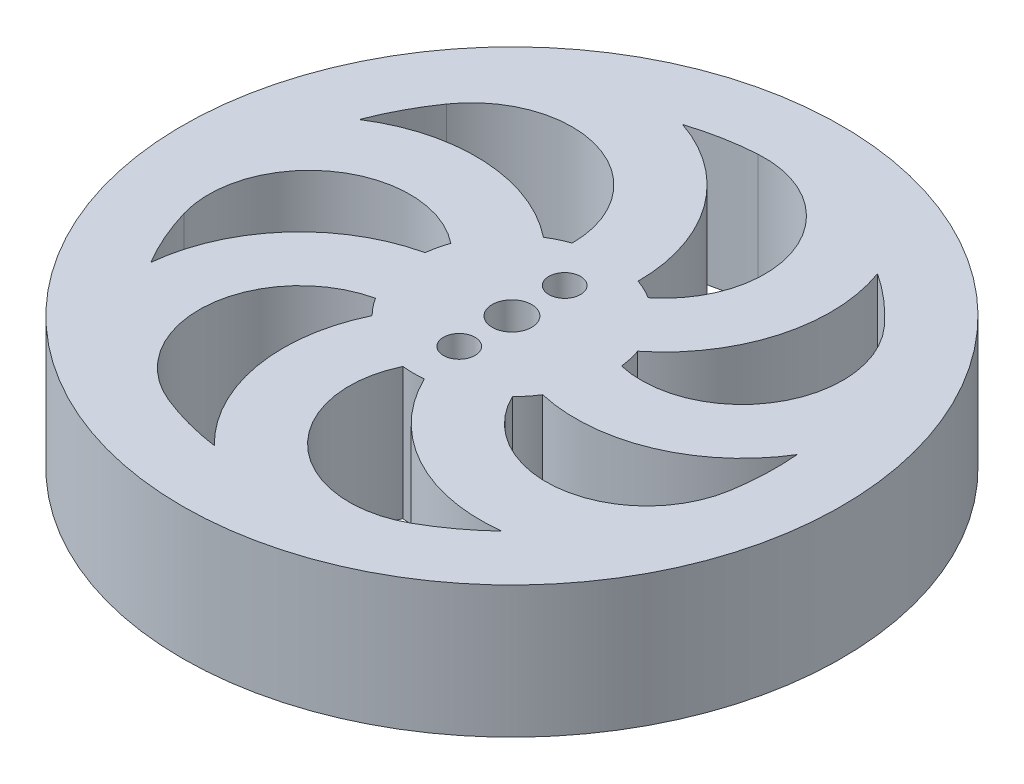
ISO-10303-21;
HEADER;
FILE_DESCRIPTION(('STEP AP214'),'2;1');
FILE_NAME('part.step','',(''),(''),'','','');
FILE_SCHEMA(('AUTOMOTIVE_DESIGN { 1 0 10303 214 1 1 1 1 }'));
ENDSEC;
DATA;
#1=APPLICATION_CONTEXT('core data for automotive mechanical design processes');
#2=APPLICATION_PROTOCOL_DEFINITION('international standard','automotive_design',2000,#1);
#3=PRODUCT_CONTEXT('',#1,'mechanical');
#4=PRODUCT('Part','Part','',(#3));
#5=PRODUCT_RELATED_PRODUCT_CATEGORY('part','',(#4));
#6=PRODUCT_DEFINITION_FORMATION('','',#4);
#7=PRODUCT_DEFINITION_CONTEXT('part definition',#1,'design');
#8=PRODUCT_DEFINITION('design','',#6,#7);
#9=PRODUCT_DEFINITION_SHAPE('','',#8);
#10=(LENGTH_UNIT() NAMED_UNIT(*) SI_UNIT(.MILLI.,.METRE.));
#11=(NAMED_UNIT(*) PLANE_ANGLE_UNIT() SI_UNIT($,.RADIAN.));
#12=(NAMED_UNIT(*) SI_UNIT($,.STERADIAN.) SOLID_ANGLE_UNIT());
#13=UNCERTAINTY_MEASURE_WITH_UNIT(LENGTH_MEASURE(1.E-05),#10,'distance_accuracy_value','');
#14=(GEOMETRIC_REPRESENTATION_CONTEXT(3) GLOBAL_UNCERTAINTY_ASSIGNED_CONTEXT((#13)) GLOBAL_UNIT_ASSIGNED_CONTEXT((#10,
#11,#12)) REPRESENTATION_CONTEXT('',''));
#15=CARTESIAN_POINT('',(0.,0.,0.));
#16=DIRECTION('',(0.,0.,1.));
#17=DIRECTION('',(1.,0.,0.));
#18=AXIS2_PLACEMENT_3D('',#15,#16,#17);
#19=CARTESIAN_POINT('',(0.,0.,0.));
#20=DIRECTION('',(0.,1.,0.));
#21=DIRECTION('',(0.,0.,1.));
#22=AXIS2_PLACEMENT_3D('',#19,#20,#21);
#23=PLANE('',#22);
#24=CARTESIAN_POINT('',(0.,0.,-4.));
#25=DIRECTION('',(0.,-1.,0.));
#26=DIRECTION('',(0.,0.,-1.));
#27=AXIS2_PLACEMENT_3D('',#24,#25,#26);
#28=CIRCLE('',#27,1.19999999999999);
#29=CARTESIAN_POINT('',(0.,0.,-5.19999999999999));
#30=VERTEX_POINT('',#29);
#31=EDGE_CURVE('E451',#30,#30,#28,.T.);
#32=ORIENTED_EDGE('',*,*,#31,.F.);
#33=EDGE_LOOP('',(#32));
#34=FACE_BOUND('',#33,.T.);
#35=CARTESIAN_POINT('',(12.2028445857767,0.,1.97171293970917));
#36=DIRECTION('',(0.,1.,0.));
#37=DIRECTION('',(-0.433883739117553,0.,-0.900968867902422));
#38=AXIS2_PLACEMENT_3D('',#35,#36,#37);
#39=CIRCLE('',#38,7.63888888888887);
#40=CARTESIAN_POINT('',(5.32044351152205,0.,5.28610261352378));
#41=VERTEX_POINT('',#40);
#42=CARTESIAN_POINT('',(19.7439283185599,0.,3.19018722829348));
#43=VERTEX_POINT('',#42);
#44=EDGE_CURVE('E368',#41,#43,#39,.T.);
#45=ORIENTED_EDGE('',*,*,#44,.T.);
#46=CARTESIAN_POINT('',(0.,0.,0.));
#47=DIRECTION('',(0.,1.,0.));
#48=DIRECTION('',(0.,0.,1.));
#49=AXIS2_PLACEMENT_3D('',#46,#47,#48);
#50=CIRCLE('',#49,20.);
#51=CARTESIAN_POINT('',(19.9269028790839,0.,-1.70837397766344));
#52=VERTEX_POINT('',#51);
#53=EDGE_CURVE('E427',#43,#52,#50,.T.);
#54=ORIENTED_EDGE('',*,*,#53,.T.);
#55=CARTESIAN_POINT('',(9.149896403553,0.,-8.31122516272318));
#56=DIRECTION('',(0.,1.,0.));
#57=DIRECTION('',(-0.974927912181823,0.,-0.222520933956318));
#58=AXIS2_PLACEMENT_3D('',#55,#56,#57);
#59=CIRCLE('',#58,12.6388888888889);
#60=CARTESIAN_POINT('',(6.3374790438273,0.,4.01078039401933));
#61=VERTEX_POINT('',#60);
#62=EDGE_CURVE('E391',#61,#52,#59,.T.);
#63=ORIENTED_EDGE('',*,*,#62,.F.);
#64=CARTESIAN_POINT('',(0.,0.,0.));
#65=DIRECTION('',(0.,1.,0.));
#66=DIRECTION('',(0.,0.,1.));
#67=AXIS2_PLACEMENT_3D('',#64,#65,#66);
#68=CIRCLE('',#67,7.5);
#69=EDGE_CURVE('E540',#41,#61,#68,.T.);
#70=ORIENTED_EDGE('',*,*,#69,.F.);
#71=EDGE_LOOP('',(#45,#54,#63,#70));
#72=FACE_BOUND('',#71,.T.);
#73=CARTESIAN_POINT('',(9.149896403553,0.,-8.31122516272318));
#74=DIRECTION('',(0.,1.,0.));
#75=DIRECTION('',(-0.974927912181823,0.,-0.222520933956318));
#76=AXIS2_PLACEMENT_3D('',#73,#74,#75);
#77=CIRCLE('',#76,7.63888888888887);
#78=CARTESIAN_POINT('',(7.45008371360889,0.,-0.863859166889832));
#79=VERTEX_POINT('',#78);
#80=CARTESIAN_POINT('',(14.8043267652992,0.,-13.4473755441813));
#81=VERTEX_POINT('',#80);
#82=EDGE_CURVE('E387',#79,#81,#77,.T.);
#83=ORIENTED_EDGE('',*,*,#82,.T.);
#84=CARTESIAN_POINT('',(11.0885601681718,0.,-16.6446337717846));
#85=VERTEX_POINT('',#84);
#86=EDGE_CURVE('E423',#81,#85,#50,.T.);
#87=ORIENTED_EDGE('',*,*,#86,.T.);
#88=CARTESIAN_POINT('',(-0.793110394418279,0.,-12.3356411995283));
#89=DIRECTION('',(0.,1.,0.));
#90=DIRECTION('',(-0.781831482468031,0.,0.623489801858732));
#91=AXIS2_PLACEMENT_3D('',#88,#89,#90);
#92=CIRCLE('',#91,12.6388888888889);
#93=CARTESIAN_POINT('',(7.08710793462959,0.,-2.45415996277958));
#94=VERTEX_POINT('',#93);
#95=EDGE_CURVE('E410',#94,#85,#92,.T.);
#96=ORIENTED_EDGE('',*,*,#95,.F.);
#97=EDGE_CURVE('E539',#79,#94,#68,.T.);
#98=ORIENTED_EDGE('',*,*,#97,.F.);
#99=EDGE_LOOP('',(#83,#87,#96,#98));
#100=FACE_BOUND('',#99,.T.);
#101=CARTESIAN_POINT('',(-0.793110394418279,0.,-12.3356411995283));
#102=DIRECTION('',(0.,1.,0.));
#103=DIRECTION('',(-0.781831482468031,0.,0.623489801858732));
#104=AXIS2_PLACEMENT_3D('',#101,#102,#103);
#105=CIRCLE('',#104,7.63888888888887);
#106=CARTESIAN_POINT('',(3.9696589253359,0.,-6.36331737511976));
#107=VERTEX_POINT('',#106);
#108=CARTESIAN_POINT('',(-1.28323479546328,0.,-19.9587902554166));
#109=VERTEX_POINT('',#108);
#110=EDGE_CURVE('E406',#107,#109,#105,.T.);
#111=ORIENTED_EDGE('',*,*,#110,.T.);
#112=CARTESIAN_POINT('',(-6.09969451477977,0.,-19.0471448470989));
#113=VERTEX_POINT('',#112);
#114=EDGE_CURVE('E284',#109,#113,#50,.T.);
#115=ORIENTED_EDGE('',*,*,#114,.T.);
#116=CARTESIAN_POINT('',(-10.1388888888889,0.,-7.07106781186549));
#117=DIRECTION('',(0.,1.,0.));
#118=DIRECTION('',(0.,0.,1.));
#119=AXIS2_PLACEMENT_3D('',#116,#117,#118);
#120=CIRCLE('',#119,12.6388888888889);
#121=CARTESIAN_POINT('',(2.5,0.,-7.07106781186547));
#122=VERTEX_POINT('',#121);
#123=EDGE_CURVE('E290',#122,#113,#120,.T.);
#124=ORIENTED_EDGE('',*,*,#123,.F.);
#125=EDGE_CURVE('E287',#107,#122,#68,.T.);
#126=ORIENTED_EDGE('',*,*,#125,.F.);
#127=EDGE_LOOP('',(#111,#115,#124,#126));
#128=FACE_BOUND('',#127,.T.);
#129=CARTESIAN_POINT('',(-11.8498772543839,0.,3.51816386162883));
#130=DIRECTION('',(0.,1.,0.));
#131=DIRECTION('',(0.781831482468022,0.,0.623489801858743));
#132=AXIS2_PLACEMENT_3D('',#129,#130,#131);
#133=CIRCLE('',#132,7.63888888888887);
#134=CARTESIAN_POINT('',(-7.08710793462957,0.,-2.45415996277965));
#135=VERTEX_POINT('',#134);
#136=CARTESIAN_POINT('',(-19.1728351082166,0.,5.69231006825337));
#137=VERTEX_POINT('',#136);
#138=EDGE_CURVE('E448',#135,#137,#133,.T.);
#139=ORIENTED_EDGE('',*,*,#138,.T.);
#140=CARTESIAN_POINT('',(-17.21228343853,0.,10.1851508988186));
#141=VERTEX_POINT('',#140);
#142=EDGE_CURVE('E244',#137,#141,#50,.T.);
#143=ORIENTED_EDGE('',*,*,#142,.T.);
#144=CARTESIAN_POINT('',(-4.63766635388336,0.,11.4581463898527));
#145=DIRECTION('',(0.,1.,0.));
#146=DIRECTION('',(0.974927912181826,0.,-0.222520933956305));
#147=AXIS2_PLACEMENT_3D('',#144,#145,#146);
#148=CIRCLE('',#147,12.6388888888889);
#149=CARTESIAN_POINT('',(-7.45008371360888,0.,-0.863859166889897));
#150=VERTEX_POINT('',#149);
#151=EDGE_CURVE('E335',#150,#141,#148,.T.);
#152=ORIENTED_EDGE('',*,*,#151,.F.);
#153=EDGE_CURVE('E291',#135,#150,#68,.T.);
#154=ORIENTED_EDGE('',*,*,#153,.F.);
#155=EDGE_LOOP('',(#139,#143,#152,#154));
#156=FACE_BOUND('',#155,.T.);
#157=CARTESIAN_POINT('',(-4.63766635388336,0.,11.4581463898527));
#158=DIRECTION('',(0.,1.,0.));
#159=DIRECTION('',(0.974927912181826,0.,-0.222520933956305));
#160=AXIS2_PLACEMENT_3D('',#157,#158,#159);
#161=CIRCLE('',#160,7.63888888888887);
#162=CARTESIAN_POINT('',(-6.33747904382733,0.,4.01078039401927));
#163=VERTEX_POINT('',#162);
#164=CARTESIAN_POINT('',(-7.50363994336183,0.,18.5390233723458));
#165=VERTEX_POINT('',#164);
#166=EDGE_CURVE('E245',#163,#165,#161,.T.);
#167=ORIENTED_EDGE('',*,*,#166,.T.);
#168=CARTESIAN_POINT('',(-2.76861156424142,0.,19.8074427932116));
#169=VERTEX_POINT('',#168);
#170=EDGE_CURVE('E437',#165,#169,#50,.T.);
#171=ORIENTED_EDGE('',*,*,#170,.T.);
#172=CARTESIAN_POINT('',(6.06680190224457,0.,10.7699109829263));
#173=DIRECTION('',(0.,1.,0.));
#174=DIRECTION('',(0.433883739117565,0.,-0.900968867902416));
#175=AXIS2_PLACEMENT_3D('',#172,#173,#174);
#176=CIRCLE('',#175,12.6388888888889);
#177=CARTESIAN_POINT('',(-5.3204435115221,0.,5.28610261352373));
#178=VERTEX_POINT('',#177);
#179=EDGE_CURVE('E353',#178,#169,#176,.T.);
#180=ORIENTED_EDGE('',*,*,#179,.F.);
#181=EDGE_CURVE('E544',#163,#178,#68,.T.);
#182=ORIENTED_EDGE('',*,*,#181,.F.);
#183=EDGE_LOOP('',(#167,#171,#180,#182));
#184=FACE_BOUND('',#183,.T.);
#185=CARTESIAN_POINT('',(6.06680190224457,0.,10.7699109829263));
#186=DIRECTION('',(0.,1.,0.));
#187=DIRECTION('',(0.433883739117565,0.,-0.900968867902416));
#188=AXIS2_PLACEMENT_3D('',#185,#186,#187);
#189=CIRCLE('',#188,7.63888888888887);
#190=CARTESIAN_POINT('',(-0.815599172009975,0.,7.45552130911157));
#191=VERTEX_POINT('',#190);
#192=CARTESIAN_POINT('',(9.81594914520467,0.,17.4254739499032));
#193=VERTEX_POINT('',#192);
#194=EDGE_CURVE('E349',#191,#193,#189,.T.);
#195=ORIENTED_EDGE('',*,*,#194,.T.);
#196=CARTESIAN_POINT('',(13.7598812873046,0.,14.5143262661167));
#197=VERTEX_POINT('',#196);
#198=EDGE_CURVE('E432',#193,#197,#50,.T.);
#199=ORIENTED_EDGE('',*,*,#198,.T.);
#200=CARTESIAN_POINT('',(12.2028445857767,0.,1.97171293970917));
#201=DIRECTION('',(0.,1.,0.));
#202=DIRECTION('',(-0.433883739117553,0.,-0.900968867902422));
#203=AXIS2_PLACEMENT_3D('',#200,#201,#202);
#204=CIRCLE('',#203,12.6388888888889);
#205=CARTESIAN_POINT('',(0.815599172009904,0.,7.45552130911157));
#206=VERTEX_POINT('',#205);
#207=EDGE_CURVE('E372',#206,#197,#204,.T.);
#208=ORIENTED_EDGE('',*,*,#207,.F.);
#209=EDGE_CURVE('E542',#191,#206,#68,.T.);
#210=ORIENTED_EDGE('',*,*,#209,.F.);
#211=EDGE_LOOP('',(#195,#199,#208,#210));
#212=FACE_BOUND('',#211,.T.);
#213=CARTESIAN_POINT('',(-16.4044943820225,0.,-11.4408288191981));
#214=VERTEX_POINT('',#213);
#215=CARTESIAN_POINT('',(-18.6947548170094,0.,-7.10676736160013));
#216=VERTEX_POINT('',#215);
#217=EDGE_CURVE('E280',#214,#216,#50,.T.);
#218=ORIENTED_EDGE('',*,*,#217,.T.);
#219=CARTESIAN_POINT('',(-11.8498772543839,0.,3.51816386162883));
#220=DIRECTION('',(0.,1.,0.));
#221=DIRECTION('',(0.781831482468022,0.,0.623489801858743));
#222=AXIS2_PLACEMENT_3D('',#219,#220,#221);
#223=CIRCLE('',#222,12.6388888888889);
#224=CARTESIAN_POINT('',(-3.96965892533584,0.,-6.3633173751198));
#225=VERTEX_POINT('',#224);
#226=EDGE_CURVE('E236',#225,#216,#223,.T.);
#227=ORIENTED_EDGE('',*,*,#226,.F.);
#228=CARTESIAN_POINT('',(-2.50000000000004,0.,-7.07106781186546));
#229=VERTEX_POINT('',#228);
#230=EDGE_CURVE('E288',#229,#225,#68,.T.);
#231=ORIENTED_EDGE('',*,*,#230,.F.);
#232=CARTESIAN_POINT('',(-10.1388888888889,0.,-7.07106781186549));
#233=DIRECTION('',(0.,1.,0.));
#234=DIRECTION('',(0.,0.,1.));
#235=AXIS2_PLACEMENT_3D('',#232,#233,#234);
#236=CIRCLE('',#235,7.63888888888887);
#237=EDGE_CURVE('E283',#229,#214,#236,.T.);
#238=ORIENTED_EDGE('',*,*,#237,.T.);
#239=EDGE_LOOP('',(#218,#227,#231,#238));
#240=FACE_BOUND('',#239,.T.);
#241=CARTESIAN_POINT('',(0.,0.,0.));
#242=DIRECTION('',(0.,1.,0.));
#243=DIRECTION('',(0.,0.,1.));
#244=AXIS2_PLACEMENT_3D('',#241,#242,#243);
#245=CIRCLE('',#244,25.);
#246=CARTESIAN_POINT('',(0.,0.,25.));
#247=VERTEX_POINT('',#246);
#248=EDGE_CURVE('E294',#247,#247,#245,.T.);
#249=ORIENTED_EDGE('',*,*,#248,.F.);
#250=EDGE_LOOP('',(#249));
#251=FACE_BOUND('',#250,.T.);
#252=CARTESIAN_POINT('',(0.,0.,0.));
#253=DIRECTION('',(0.,1.,0.));
#254=DIRECTION('',(0.,0.,1.));
#255=AXIS2_PLACEMENT_3D('',#252,#253,#254);
#256=CIRCLE('',#255,1.5);
#257=CARTESIAN_POINT('',(0.,0.,1.5));
#258=VERTEX_POINT('',#257);
#259=EDGE_CURVE('E297',#258,#258,#256,.T.);
#260=ORIENTED_EDGE('',*,*,#259,.T.);
#261=EDGE_LOOP('',(#260));
#262=FACE_BOUND('',#261,.T.);
#263=CARTESIAN_POINT('',(0.,0.,4.));
#264=DIRECTION('',(0.,-1.,0.));
#265=DIRECTION('',(0.,0.,-1.));
#266=AXIS2_PLACEMENT_3D('',#263,#264,#265);
#267=CIRCLE('',#266,1.19999999999999);
#268=CARTESIAN_POINT('',(0.,0.,2.80000000000001));
#269=VERTEX_POINT('',#268);
#270=EDGE_CURVE('E459',#269,#269,#267,.T.);
#271=ORIENTED_EDGE('',*,*,#270,.F.);
#272=EDGE_LOOP('',(#271));
#273=FACE_BOUND('',#272,.T.);
#274=ADVANCED_FACE('F39',(#34,#72,#100,#128,#156,#184,#212,#240,#251,#262,#273),#23,.F.);
#275=CARTESIAN_POINT('',(0.,10.,0.));
#276=DIRECTION('',(0.,1.,0.));
#277=DIRECTION('',(0.,0.,1.));
#278=AXIS2_PLACEMENT_3D('',#275,#276,#277);
#279=PLANE('',#278);
#280=CARTESIAN_POINT('',(0.,10.,4.));
#281=DIRECTION('',(0.,-1.,0.));
#282=DIRECTION('',(0.,0.,-1.));
#283=AXIS2_PLACEMENT_3D('',#280,#281,#282);
#284=CIRCLE('',#283,1.2);
#285=CARTESIAN_POINT('',(0.,10.,2.8));
#286=VERTEX_POINT('',#285);
#287=EDGE_CURVE('E456',#286,#286,#284,.T.);
#288=ORIENTED_EDGE('',*,*,#287,.T.);
#289=EDGE_LOOP('',(#288));
#290=FACE_BOUND('',#289,.T.);
#291=CARTESIAN_POINT('',(0.,10.,0.));
#292=DIRECTION('',(0.,1.,0.));
#293=DIRECTION('',(0.,0.,1.));
#294=AXIS2_PLACEMENT_3D('',#291,#292,#293);
#295=CIRCLE('',#294,1.5);
#296=CARTESIAN_POINT('',(0.,10.,1.5));
#297=VERTEX_POINT('',#296);
#298=EDGE_CURVE('E276',#297,#297,#295,.T.);
#299=ORIENTED_EDGE('',*,*,#298,.F.);
#300=EDGE_LOOP('',(#299));
#301=FACE_BOUND('',#300,.T.);
#302=CARTESIAN_POINT('',(0.,10.,0.));
#303=DIRECTION('',(0.,1.,0.));
#304=DIRECTION('',(0.,0.,1.));
#305=AXIS2_PLACEMENT_3D('',#302,#303,#304);
#306=CIRCLE('',#305,25.);
#307=CARTESIAN_POINT('',(0.,10.,25.));
#308=VERTEX_POINT('',#307);
#309=EDGE_CURVE('E273',#308,#308,#306,.T.);
#310=ORIENTED_EDGE('',*,*,#309,.T.);
#311=EDGE_LOOP('',(#310));
#312=FACE_BOUND('',#311,.T.);
#313=CARTESIAN_POINT('',(0.,10.,0.));
#314=DIRECTION('',(0.,1.,0.));
#315=DIRECTION('',(0.,0.,1.));
#316=AXIS2_PLACEMENT_3D('',#313,#314,#315);
#317=CIRCLE('',#316,20.);
#318=CARTESIAN_POINT('',(-16.4044943820225,10.,-11.4408288191981));
#319=VERTEX_POINT('',#318);
#320=CARTESIAN_POINT('',(-18.6947548170094,10.,-7.10676736160013));
#321=VERTEX_POINT('',#320);
#322=EDGE_CURVE('E252',#319,#321,#317,.T.);
#323=ORIENTED_EDGE('',*,*,#322,.F.);
#324=CARTESIAN_POINT('',(-10.1388888888889,10.,-7.07106781186549));
#325=DIRECTION('',(0.,1.,0.));
#326=DIRECTION('',(0.,0.,1.));
#327=AXIS2_PLACEMENT_3D('',#324,#325,#326);
#328=CIRCLE('',#327,7.63888888888887);
#329=CARTESIAN_POINT('',(-2.50000000000004,10.,-7.07106781186546));
#330=VERTEX_POINT('',#329);
#331=EDGE_CURVE('E256',#330,#319,#328,.T.);
#332=ORIENTED_EDGE('',*,*,#331,.F.);
#333=CARTESIAN_POINT('',(0.,10.,0.));
#334=DIRECTION('',(0.,1.,0.));
#335=DIRECTION('',(0.,0.,1.));
#336=AXIS2_PLACEMENT_3D('',#333,#334,#335);
#337=CIRCLE('',#336,7.5);
#338=CARTESIAN_POINT('',(-3.96965892533584,10.,-6.3633173751198));
#339=VERTEX_POINT('',#338);
#340=EDGE_CURVE('E266',#330,#339,#337,.T.);
#341=ORIENTED_EDGE('',*,*,#340,.T.);
#342=CARTESIAN_POINT('',(-11.8498772543839,10.,3.51816386162883));
#343=DIRECTION('',(0.,1.,0.));
#344=DIRECTION('',(0.781831482468022,0.,0.623489801858743));
#345=AXIS2_PLACEMENT_3D('',#342,#343,#344);
#346=CIRCLE('',#345,12.6388888888889);
#347=EDGE_CURVE('E235',#339,#321,#346,.T.);
#348=ORIENTED_EDGE('',*,*,#347,.T.);
#349=EDGE_LOOP('',(#323,#332,#341,#348));
#350=FACE_BOUND('',#349,.T.);
#351=CARTESIAN_POINT('',(9.81594914520467,10.,17.4254739499032));
#352=VERTEX_POINT('',#351);
#353=CARTESIAN_POINT('',(13.7598812873046,10.,14.5143262661167));
#354=VERTEX_POINT('',#353);
#355=EDGE_CURVE('E259',#352,#354,#317,.T.);
#356=ORIENTED_EDGE('',*,*,#355,.F.);
#357=CARTESIAN_POINT('',(6.06680190224457,10.,10.7699109829263));
#358=DIRECTION('',(0.,1.,0.));
#359=DIRECTION('',(0.433883739117565,0.,-0.900968867902416));
#360=AXIS2_PLACEMENT_3D('',#357,#358,#359);
#361=CIRCLE('',#360,7.63888888888887);
#362=CARTESIAN_POINT('',(-0.815599172009975,10.,7.45552130911157));
#363=VERTEX_POINT('',#362);
#364=EDGE_CURVE('E350',#363,#352,#361,.T.);
#365=ORIENTED_EDGE('',*,*,#364,.F.);
#366=CARTESIAN_POINT('',(0.815599172009904,10.,7.45552130911157));
#367=VERTEX_POINT('',#366);
#368=EDGE_CURVE('E996',#363,#367,#337,.T.);
#369=ORIENTED_EDGE('',*,*,#368,.T.);
#370=CARTESIAN_POINT('',(12.2028445857767,10.,1.97171293970917));
#371=DIRECTION('',(0.,1.,0.));
#372=DIRECTION('',(-0.433883739117553,0.,-0.900968867902422));
#373=AXIS2_PLACEMENT_3D('',#370,#371,#372);
#374=CIRCLE('',#373,12.6388888888889);
#375=EDGE_CURVE('E371',#367,#354,#374,.T.);
#376=ORIENTED_EDGE('',*,*,#375,.T.);
#377=EDGE_LOOP('',(#356,#365,#369,#376));
#378=FACE_BOUND('',#377,.T.);
#379=CARTESIAN_POINT('',(-7.50363994336183,10.,18.5390233723458));
#380=VERTEX_POINT('',#379);
#381=CARTESIAN_POINT('',(-2.76861156424142,10.,19.8074427932116));
#382=VERTEX_POINT('',#381);
#383=EDGE_CURVE('E253',#380,#382,#317,.T.);
#384=ORIENTED_EDGE('',*,*,#383,.F.);
#385=CARTESIAN_POINT('',(-4.63766635388336,10.,11.4581463898527));
#386=DIRECTION('',(0.,1.,0.));
#387=DIRECTION('',(0.974927912181826,0.,-0.222520933956305));
#388=AXIS2_PLACEMENT_3D('',#385,#386,#387);
#389=CIRCLE('',#388,7.63888888888887);
#390=CARTESIAN_POINT('',(-6.33747904382733,10.,4.01078039401927));
#391=VERTEX_POINT('',#390);
#392=EDGE_CURVE('E333',#391,#380,#389,.T.);
#393=ORIENTED_EDGE('',*,*,#392,.F.);
#394=CARTESIAN_POINT('',(-5.3204435115221,10.,5.28610261352373));
#395=VERTEX_POINT('',#394);
#396=EDGE_CURVE('E991',#391,#395,#337,.T.);
#397=ORIENTED_EDGE('',*,*,#396,.T.);
#398=CARTESIAN_POINT('',(6.06680190224457,10.,10.7699109829263));
#399=DIRECTION('',(0.,1.,0.));
#400=DIRECTION('',(0.433883739117565,0.,-0.900968867902416));
#401=AXIS2_PLACEMENT_3D('',#398,#399,#400);
#402=CIRCLE('',#401,12.6388888888889);
#403=EDGE_CURVE('E352',#395,#382,#402,.T.);
#404=ORIENTED_EDGE('',*,*,#403,.T.);
#405=EDGE_LOOP('',(#384,#393,#397,#404));
#406=FACE_BOUND('',#405,.T.);
#407=CARTESIAN_POINT('',(-19.1728351082166,10.,5.69231006825338));
#408=VERTEX_POINT('',#407);
#409=CARTESIAN_POINT('',(-17.21228343853,10.,10.1851508988186));
#410=VERTEX_POINT('',#409);
#411=EDGE_CURVE('E242',#408,#410,#317,.T.);
#412=ORIENTED_EDGE('',*,*,#411,.F.);
#413=CARTESIAN_POINT('',(-11.8498772543839,10.,3.51816386162883));
#414=DIRECTION('',(0.,1.,0.));
#415=DIRECTION('',(0.781831482468022,0.,0.623489801858743));
#416=AXIS2_PLACEMENT_3D('',#413,#414,#415);
#417=CIRCLE('',#416,7.63888888888887);
#418=CARTESIAN_POINT('',(-7.08710793462957,10.,-2.45415996277965));
#419=VERTEX_POINT('',#418);
#420=EDGE_CURVE('E225',#419,#408,#417,.T.);
#421=ORIENTED_EDGE('',*,*,#420,.F.);
#422=CARTESIAN_POINT('',(-7.45008371360888,10.,-0.863859166889897));
#423=VERTEX_POINT('',#422);
#424=EDGE_CURVE('E270',#419,#423,#337,.T.);
#425=ORIENTED_EDGE('',*,*,#424,.T.);
#426=CARTESIAN_POINT('',(-4.63766635388336,10.,11.4581463898527));
#427=DIRECTION('',(0.,1.,0.));
#428=DIRECTION('',(0.974927912181826,0.,-0.222520933956305));
#429=AXIS2_PLACEMENT_3D('',#426,#427,#428);
#430=CIRCLE('',#429,12.6388888888889);
#431=EDGE_CURVE('E250',#423,#410,#430,.T.);
#432=ORIENTED_EDGE('',*,*,#431,.T.);
#433=EDGE_LOOP('',(#412,#421,#425,#432));
#434=FACE_BOUND('',#433,.T.);
#435=CARTESIAN_POINT('',(-1.28323479546328,10.,-19.9587902554166));
#436=VERTEX_POINT('',#435);
#437=CARTESIAN_POINT('',(-6.09969451477977,10.,-19.0471448470989));
#438=VERTEX_POINT('',#437);
#439=EDGE_CURVE('E257',#436,#438,#317,.T.);
#440=ORIENTED_EDGE('',*,*,#439,.F.);
#441=CARTESIAN_POINT('',(-0.793110394418279,10.,-12.3356411995283));
#442=DIRECTION('',(0.,1.,0.));
#443=DIRECTION('',(-0.781831482468031,0.,0.623489801858732));
#444=AXIS2_PLACEMENT_3D('',#441,#442,#443);
#445=CIRCLE('',#444,7.63888888888887);
#446=CARTESIAN_POINT('',(3.9696589253359,10.,-6.36331737511976));
#447=VERTEX_POINT('',#446);
#448=EDGE_CURVE('E407',#447,#436,#445,.T.);
#449=ORIENTED_EDGE('',*,*,#448,.F.);
#450=CARTESIAN_POINT('',(2.5,10.,-7.07106781186547));
#451=VERTEX_POINT('',#450);
#452=EDGE_CURVE('E54',#447,#451,#337,.T.);
#453=ORIENTED_EDGE('',*,*,#452,.T.);
#454=CARTESIAN_POINT('',(-10.1388888888889,10.,-7.07106781186549));
#455=DIRECTION('',(0.,1.,0.));
#456=DIRECTION('',(0.,0.,1.));
#457=AXIS2_PLACEMENT_3D('',#454,#455,#456);
#458=CIRCLE('',#457,12.6388888888889);
#459=EDGE_CURVE('E269',#451,#438,#458,.T.);
#460=ORIENTED_EDGE('',*,*,#459,.T.);
#461=EDGE_LOOP('',(#440,#449,#453,#460));
#462=FACE_BOUND('',#461,.T.);
#463=CARTESIAN_POINT('',(14.8043267652992,10.,-13.4473755441813));
#464=VERTEX_POINT('',#463);
#465=CARTESIAN_POINT('',(11.0885601681718,10.,-16.6446337717846));
#466=VERTEX_POINT('',#465);
#467=EDGE_CURVE('E529',#464,#466,#317,.T.);
#468=ORIENTED_EDGE('',*,*,#467,.F.);
#469=CARTESIAN_POINT('',(9.149896403553,10.,-8.31122516272318));
#470=DIRECTION('',(0.,1.,0.));
#471=DIRECTION('',(-0.974927912181823,0.,-0.222520933956318));
#472=AXIS2_PLACEMENT_3D('',#469,#470,#471);
#473=CIRCLE('',#472,7.63888888888887);
#474=CARTESIAN_POINT('',(7.45008371360889,10.,-0.863859166889832));
#475=VERTEX_POINT('',#474);
#476=EDGE_CURVE('E388',#475,#464,#473,.T.);
#477=ORIENTED_EDGE('',*,*,#476,.F.);
#478=CARTESIAN_POINT('',(7.08710793462959,10.,-2.45415996277958));
#479=VERTEX_POINT('',#478);
#480=EDGE_CURVE('E1011',#475,#479,#337,.T.);
#481=ORIENTED_EDGE('',*,*,#480,.T.);
#482=CARTESIAN_POINT('',(-0.793110394418279,10.,-12.3356411995283));
#483=DIRECTION('',(0.,1.,0.));
#484=DIRECTION('',(-0.781831482468031,0.,0.623489801858732));
#485=AXIS2_PLACEMENT_3D('',#482,#483,#484);
#486=CIRCLE('',#485,12.6388888888889);
#487=EDGE_CURVE('E409',#479,#466,#486,.T.);
#488=ORIENTED_EDGE('',*,*,#487,.T.);
#489=EDGE_LOOP('',(#468,#477,#481,#488));
#490=FACE_BOUND('',#489,.T.);
#491=CARTESIAN_POINT('',(19.7439283185599,10.,3.19018722829348));
#492=VERTEX_POINT('',#491);
#493=CARTESIAN_POINT('',(19.9269028790839,10.,-1.70837397766344));
#494=VERTEX_POINT('',#493);
#495=EDGE_CURVE('E520',#492,#494,#317,.T.);
#496=ORIENTED_EDGE('',*,*,#495,.F.);
#497=CARTESIAN_POINT('',(12.2028445857767,10.,1.97171293970917));
#498=DIRECTION('',(0.,1.,0.));
#499=DIRECTION('',(-0.433883739117553,0.,-0.900968867902422));
#500=AXIS2_PLACEMENT_3D('',#497,#498,#499);
#501=CIRCLE('',#500,7.63888888888887);
#502=CARTESIAN_POINT('',(5.32044351152205,10.,5.28610261352378));
#503=VERTEX_POINT('',#502);
#504=EDGE_CURVE('E369',#503,#492,#501,.T.);
#505=ORIENTED_EDGE('',*,*,#504,.F.);
#506=CARTESIAN_POINT('',(6.3374790438273,10.,4.01078039401933));
#507=VERTEX_POINT('',#506);
#508=EDGE_CURVE('E1010',#503,#507,#337,.T.);
#509=ORIENTED_EDGE('',*,*,#508,.T.);
#510=CARTESIAN_POINT('',(9.149896403553,10.,-8.31122516272318));
#511=DIRECTION('',(0.,1.,0.));
#512=DIRECTION('',(-0.974927912181823,0.,-0.222520933956318));
#513=AXIS2_PLACEMENT_3D('',#510,#511,#512);
#514=CIRCLE('',#513,12.6388888888889);
#515=EDGE_CURVE('E390',#507,#494,#514,.T.);
#516=ORIENTED_EDGE('',*,*,#515,.T.);
#517=EDGE_LOOP('',(#496,#505,#509,#516));
#518=FACE_BOUND('',#517,.T.);
#519=CARTESIAN_POINT('',(0.,10.,-4.));
#520=DIRECTION('',(0.,-1.,0.));
#521=DIRECTION('',(0.,0.,-1.));
#522=AXIS2_PLACEMENT_3D('',#519,#520,#521);
#523=CIRCLE('',#522,1.2);
#524=CARTESIAN_POINT('',(0.,10.,-5.2));
#525=VERTEX_POINT('',#524);
#526=EDGE_CURVE('E449',#525,#525,#523,.T.);
#527=ORIENTED_EDGE('',*,*,#526,.T.);
#528=EDGE_LOOP('',(#527));
#529=FACE_BOUND('',#528,.T.);
#530=ADVANCED_FACE('F247',(#290,#301,#312,#350,#378,#406,#434,#462,#490,#518,#529),#279,.T.);
#531=CARTESIAN_POINT('',(0.,10.,0.));
#532=DIRECTION('',(0.,-1.,0.));
#533=DIRECTION('',(0.,0.,-1.));
#534=AXIS2_PLACEMENT_3D('',#531,#532,#533);
#535=CYLINDRICAL_SURFACE('',#534,20.);
#536=ORIENTED_EDGE('',*,*,#467,.T.);
#537=DIRECTION('',(0.,-1.,0.));
#538=VECTOR('',#537,1.);
#539=CARTESIAN_POINT('',(11.0885601681718,10.,-16.6446337717846));
#540=LINE('',#539,#538);
#541=EDGE_CURVE('E412',#466,#85,#540,.T.);
#542=ORIENTED_EDGE('',*,*,#541,.T.);
#543=ORIENTED_EDGE('',*,*,#86,.F.);
#544=DIRECTION('',(0.,-1.,0.));
#545=VECTOR('',#544,1.);
#546=CARTESIAN_POINT('',(14.8043267652992,10.,-13.4473755441813));
#547=LINE('',#546,#545);
#548=EDGE_CURVE('E403',#464,#81,#547,.T.);
#549=ORIENTED_EDGE('',*,*,#548,.F.);
#550=EDGE_LOOP('',(#536,#542,#543,#549));
#551=FACE_BOUND('',#550,.T.);
#552=ADVANCED_FACE('F471',(#551),#535,.F.);
#553=ORIENTED_EDGE('',*,*,#355,.T.);
#554=DIRECTION('',(0.,-1.,0.));
#555=VECTOR('',#554,1.);
#556=CARTESIAN_POINT('',(13.7598812873046,10.,14.5143262661167));
#557=LINE('',#556,#555);
#558=EDGE_CURVE('E374',#354,#197,#557,.T.);
#559=ORIENTED_EDGE('',*,*,#558,.T.);
#560=ORIENTED_EDGE('',*,*,#198,.F.);
#561=DIRECTION('',(0.,-1.,0.));
#562=VECTOR('',#561,1.);
#563=CARTESIAN_POINT('',(9.81594914520467,10.,17.4254739499032));
#564=LINE('',#563,#562);
#565=EDGE_CURVE('E365',#352,#193,#564,.T.);
#566=ORIENTED_EDGE('',*,*,#565,.F.);
#567=EDGE_LOOP('',(#553,#559,#560,#566));
#568=FACE_BOUND('',#567,.T.);
#569=ADVANCED_FACE('F506',(#568),#535,.F.);
#570=ORIENTED_EDGE('',*,*,#411,.T.);
#571=DIRECTION('',(0.,-1.,0.));
#572=VECTOR('',#571,1.);
#573=CARTESIAN_POINT('',(-17.21228343853,10.,10.1851508988186));
#574=LINE('',#573,#572);
#575=EDGE_CURVE('E337',#410,#141,#574,.T.);
#576=ORIENTED_EDGE('',*,*,#575,.T.);
#577=ORIENTED_EDGE('',*,*,#142,.F.);
#578=DIRECTION('',(0.,-1.,0.));
#579=VECTOR('',#578,1.);
#580=CARTESIAN_POINT('',(-19.1728351082166,10.,5.69231006825338));
#581=LINE('',#580,#579);
#582=EDGE_CURVE('E229',#408,#137,#581,.T.);
#583=ORIENTED_EDGE('',*,*,#582,.F.);
#584=EDGE_LOOP('',(#570,#576,#577,#583));
#585=FACE_BOUND('',#584,.T.);
#586=ADVANCED_FACE('F240',(#585),#535,.F.);
#587=ORIENTED_EDGE('',*,*,#322,.T.);
#588=DIRECTION('',(0.,-1.,0.));
#589=VECTOR('',#588,1.);
#590=CARTESIAN_POINT('',(-18.6947548170094,10.,-7.10676736160013));
#591=LINE('',#590,#589);
#592=EDGE_CURVE('E322',#321,#216,#591,.T.);
#593=ORIENTED_EDGE('',*,*,#592,.T.);
#594=ORIENTED_EDGE('',*,*,#217,.F.);
#595=DIRECTION('',(0.,-1.,0.));
#596=VECTOR('',#595,1.);
#597=CARTESIAN_POINT('',(-16.4044943820225,10.,-11.4408288191981));
#598=LINE('',#597,#596);
#599=EDGE_CURVE('E11',#319,#214,#598,.T.);
#600=ORIENTED_EDGE('',*,*,#599,.F.);
#601=EDGE_LOOP('',(#587,#593,#594,#600));
#602=FACE_BOUND('',#601,.T.);
#603=ADVANCED_FACE('F320',(#602),#535,.F.);
#604=DIRECTION('',(0.,-1.,0.));
#605=VECTOR('',#604,1.);
#606=CARTESIAN_POINT('',(-7.50363994336183,10.,18.5390233723458));
#607=LINE('',#606,#605);
#608=EDGE_CURVE('E346',#380,#165,#607,.T.);
#609=ORIENTED_EDGE('',*,*,#608,.F.);
#610=ORIENTED_EDGE('',*,*,#383,.T.);
#611=DIRECTION('',(0.,-1.,0.));
#612=VECTOR('',#611,1.);
#613=CARTESIAN_POINT('',(-2.76861156424142,10.,19.8074427932116));
#614=LINE('',#613,#612);
#615=EDGE_CURVE('E355',#382,#169,#614,.T.);
#616=ORIENTED_EDGE('',*,*,#615,.T.);
#617=ORIENTED_EDGE('',*,*,#170,.F.);
#618=EDGE_LOOP('',(#609,#610,#616,#617));
#619=FACE_BOUND('',#618,.T.);
#620=ADVANCED_FACE('F509',(#619),#535,.F.);
#621=DIRECTION('',(0.,-1.,0.));
#622=VECTOR('',#621,1.);
#623=CARTESIAN_POINT('',(19.7439283185599,10.,3.19018722829348));
#624=LINE('',#623,#622);
#625=EDGE_CURVE('E384',#492,#43,#624,.T.);
#626=ORIENTED_EDGE('',*,*,#625,.F.);
#627=ORIENTED_EDGE('',*,*,#495,.T.);
#628=DIRECTION('',(0.,-1.,0.));
#629=VECTOR('',#628,1.);
#630=CARTESIAN_POINT('',(19.9269028790839,10.,-1.70837397766344));
#631=LINE('',#630,#629);
#632=EDGE_CURVE('E393',#494,#52,#631,.T.);
#633=ORIENTED_EDGE('',*,*,#632,.T.);
#634=ORIENTED_EDGE('',*,*,#53,.F.);
#635=EDGE_LOOP('',(#626,#627,#633,#634));
#636=FACE_BOUND('',#635,.T.);
#637=ADVANCED_FACE('F499',(#636),#535,.F.);
#638=CARTESIAN_POINT('',(0.,10.,0.));
#639=DIRECTION('',(0.,-1.,0.));
#640=DIRECTION('',(0.,0.,-1.));
#641=AXIS2_PLACEMENT_3D('',#638,#639,#640);
#642=CYLINDRICAL_SURFACE('',#641,7.5);
#643=DIRECTION('',(0.,-1.,0.));
#644=VECTOR('',#643,1.);
#645=CARTESIAN_POINT('',(7.08710793462959,10.,-2.45415996277958));
#646=LINE('',#645,#644);
#647=EDGE_CURVE('E62',#479,#94,#646,.T.);
#648=ORIENTED_EDGE('',*,*,#647,.F.);
#649=ORIENTED_EDGE('',*,*,#480,.F.);
#650=DIRECTION('',(0.,-1.,0.));
#651=VECTOR('',#650,1.);
#652=CARTESIAN_POINT('',(7.45008371360889,10.,-0.863859166889832));
#653=LINE('',#652,#651);
#654=EDGE_CURVE('E401',#475,#79,#653,.T.);
#655=ORIENTED_EDGE('',*,*,#654,.T.);
#656=ORIENTED_EDGE('',*,*,#97,.T.);
#657=EDGE_LOOP('',(#648,#649,#655,#656));
#658=FACE_BOUND('',#657,.T.);
#659=ADVANCED_FACE('F492',(#658),#642,.T.);
#660=DIRECTION('',(0.,-1.,0.));
#661=VECTOR('',#660,1.);
#662=CARTESIAN_POINT('',(0.815599172009904,10.,7.45552130911157));
#663=LINE('',#662,#661);
#664=EDGE_CURVE('E379',#367,#206,#663,.T.);
#665=ORIENTED_EDGE('',*,*,#664,.F.);
#666=ORIENTED_EDGE('',*,*,#368,.F.);
#667=DIRECTION('',(0.,-1.,0.));
#668=VECTOR('',#667,1.);
#669=CARTESIAN_POINT('',(-0.815599172009973,10.,7.45552130911157));
#670=LINE('',#669,#668);
#671=EDGE_CURVE('E363',#363,#191,#670,.T.);
#672=ORIENTED_EDGE('',*,*,#671,.T.);
#673=ORIENTED_EDGE('',*,*,#209,.T.);
#674=EDGE_LOOP('',(#665,#666,#672,#673));
#675=FACE_BOUND('',#674,.T.);
#676=ADVANCED_FACE('F515',(#675),#642,.T.);
#677=DIRECTION('',(0.,-1.,0.));
#678=VECTOR('',#677,1.);
#679=CARTESIAN_POINT('',(-7.45008371360888,10.,-0.863859166889897));
#680=LINE('',#679,#678);
#681=EDGE_CURVE('E341',#423,#150,#680,.T.);
#682=ORIENTED_EDGE('',*,*,#681,.F.);
#683=ORIENTED_EDGE('',*,*,#424,.F.);
#684=DIRECTION('',(0.,-1.,0.));
#685=VECTOR('',#684,1.);
#686=CARTESIAN_POINT('',(-7.08710793462957,10.,-2.45415996277965));
#687=LINE('',#686,#685);
#688=EDGE_CURVE('E231',#419,#135,#687,.T.);
#689=ORIENTED_EDGE('',*,*,#688,.T.);
#690=ORIENTED_EDGE('',*,*,#153,.T.);
#691=EDGE_LOOP('',(#682,#683,#689,#690));
#692=FACE_BOUND('',#691,.T.);
#693=ADVANCED_FACE('F550',(#692),#642,.T.);
#694=DIRECTION('',(0.,-1.,0.));
#695=VECTOR('',#694,1.);
#696=CARTESIAN_POINT('',(-3.96965892533584,10.,-6.3633173751198));
#697=LINE('',#696,#695);
#698=EDGE_CURVE('E325',#339,#225,#697,.T.);
#699=ORIENTED_EDGE('',*,*,#698,.F.);
#700=ORIENTED_EDGE('',*,*,#340,.F.);
#701=DIRECTION('',(0.,-1.,0.));
#702=VECTOR('',#701,1.);
#703=CARTESIAN_POINT('',(-2.50000000000004,10.,-7.07106781186546));
#704=LINE('',#703,#702);
#705=EDGE_CURVE('E47',#330,#229,#704,.T.);
#706=ORIENTED_EDGE('',*,*,#705,.T.);
#707=ORIENTED_EDGE('',*,*,#230,.T.);
#708=EDGE_LOOP('',(#699,#700,#706,#707));
#709=FACE_BOUND('',#708,.T.);
#710=ADVANCED_FACE('F307',(#709),#642,.T.);
#711=ORIENTED_EDGE('',*,*,#396,.F.);
#712=DIRECTION('',(0.,-1.,0.));
#713=VECTOR('',#712,1.);
#714=CARTESIAN_POINT('',(-6.33747904382733,10.,4.01078039401927));
#715=LINE('',#714,#713);
#716=EDGE_CURVE('E344',#391,#163,#715,.T.);
#717=ORIENTED_EDGE('',*,*,#716,.T.);
#718=ORIENTED_EDGE('',*,*,#181,.T.);
#719=DIRECTION('',(0.,-1.,0.));
#720=VECTOR('',#719,1.);
#721=CARTESIAN_POINT('',(-5.32044351152209,10.,5.28610261352373));
#722=LINE('',#721,#720);
#723=EDGE_CURVE('E360',#395,#178,#722,.T.);
#724=ORIENTED_EDGE('',*,*,#723,.F.);
#725=EDGE_LOOP('',(#711,#717,#718,#724));
#726=FACE_BOUND('',#725,.T.);
#727=ADVANCED_FACE('F503',(#726),#642,.T.);
#728=ORIENTED_EDGE('',*,*,#508,.F.);
#729=DIRECTION('',(0.,-1.,0.));
#730=VECTOR('',#729,1.);
#731=CARTESIAN_POINT('',(5.32044351152205,10.,5.28610261352378));
#732=LINE('',#731,#730);
#733=EDGE_CURVE('E382',#503,#41,#732,.T.);
#734=ORIENTED_EDGE('',*,*,#733,.T.);
#735=ORIENTED_EDGE('',*,*,#69,.T.);
#736=DIRECTION('',(0.,-1.,0.));
#737=VECTOR('',#736,1.);
#738=CARTESIAN_POINT('',(6.3374790438273,10.,4.01078039401933));
#739=LINE('',#738,#737);
#740=EDGE_CURVE('E398',#507,#61,#739,.T.);
#741=ORIENTED_EDGE('',*,*,#740,.F.);
#742=EDGE_LOOP('',(#728,#734,#735,#741));
#743=FACE_BOUND('',#742,.T.);
#744=ADVANCED_FACE('F493',(#743),#642,.T.);
#745=DIRECTION('',(0.,-1.,0.));
#746=VECTOR('',#745,1.);
#747=CARTESIAN_POINT('',(-1.28323479546328,10.,-19.9587902554166));
#748=LINE('',#747,#746);
#749=EDGE_CURVE('E262',#436,#109,#748,.T.);
#750=ORIENTED_EDGE('',*,*,#749,.F.);
#751=ORIENTED_EDGE('',*,*,#439,.T.);
#752=DIRECTION('',(0.,-1.,0.));
#753=VECTOR('',#752,1.);
#754=CARTESIAN_POINT('',(-6.09969451477977,10.,-19.0471448470989));
#755=LINE('',#754,#753);
#756=EDGE_CURVE('E279',#438,#113,#755,.T.);
#757=ORIENTED_EDGE('',*,*,#756,.T.);
#758=ORIENTED_EDGE('',*,*,#114,.F.);
#759=EDGE_LOOP('',(#750,#751,#757,#758));
#760=FACE_BOUND('',#759,.T.);
#761=ADVANCED_FACE('F41',(#760),#535,.F.);
#762=CARTESIAN_POINT('',(-10.1388888888889,10.,-7.07106781186549));
#763=DIRECTION('',(0.,-1.,0.));
#764=DIRECTION('',(0.,0.,-1.));
#765=AXIS2_PLACEMENT_3D('',#762,#763,#764);
#766=CYLINDRICAL_SURFACE('',#765,7.63888888888887);
#767=ORIENTED_EDGE('',*,*,#237,.F.);
#768=ORIENTED_EDGE('',*,*,#705,.F.);
#769=ORIENTED_EDGE('',*,*,#331,.T.);
#770=ORIENTED_EDGE('',*,*,#599,.T.);
#771=EDGE_LOOP('',(#767,#768,#769,#770));
#772=FACE_BOUND('',#771,.T.);
#773=ADVANCED_FACE('F315',(#772),#766,.F.);
#774=ORIENTED_EDGE('',*,*,#452,.F.);
#775=DIRECTION('',(0.,-1.,0.));
#776=VECTOR('',#775,1.);
#777=CARTESIAN_POINT('',(3.9696589253359,10.,-6.36331737511976));
#778=LINE('',#777,#776);
#779=EDGE_CURVE('E417',#447,#107,#778,.T.);
#780=ORIENTED_EDGE('',*,*,#779,.T.);
#781=ORIENTED_EDGE('',*,*,#125,.T.);
#782=DIRECTION('',(0.,-1.,0.));
#783=VECTOR('',#782,1.);
#784=CARTESIAN_POINT('',(2.5,10.,-7.07106781186547));
#785=LINE('',#784,#783);
#786=EDGE_CURVE('E302',#451,#122,#785,.T.);
#787=ORIENTED_EDGE('',*,*,#786,.F.);
#788=EDGE_LOOP('',(#774,#780,#781,#787));
#789=FACE_BOUND('',#788,.T.);
#790=ADVANCED_FACE('F486',(#789),#642,.T.);
#791=CARTESIAN_POINT('',(0.,10.,0.));
#792=DIRECTION('',(0.,-1.,0.));
#793=DIRECTION('',(0.,0.,-1.));
#794=AXIS2_PLACEMENT_3D('',#791,#792,#793);
#795=CYLINDRICAL_SURFACE('',#794,25.);
#796=ORIENTED_EDGE('',*,*,#309,.F.);
#797=EDGE_LOOP('',(#796));
#798=FACE_BOUND('',#797,.T.);
#799=ORIENTED_EDGE('',*,*,#248,.T.);
#800=EDGE_LOOP('',(#799));
#801=FACE_BOUND('',#800,.T.);
#802=ADVANCED_FACE('F483',(#798,#801),#795,.T.);
#803=CARTESIAN_POINT('',(-10.1388888888889,10.,-7.07106781186549));
#804=DIRECTION('',(0.,-1.,0.));
#805=DIRECTION('',(0.,0.,-1.));
#806=AXIS2_PLACEMENT_3D('',#803,#804,#805);
#807=CYLINDRICAL_SURFACE('',#806,12.6388888888889);
#808=ORIENTED_EDGE('',*,*,#123,.T.);
#809=ORIENTED_EDGE('',*,*,#756,.F.);
#810=ORIENTED_EDGE('',*,*,#459,.F.);
#811=ORIENTED_EDGE('',*,*,#786,.T.);
#812=EDGE_LOOP('',(#808,#809,#810,#811));
#813=FACE_BOUND('',#812,.T.);
#814=ADVANCED_FACE('F481',(#813),#807,.T.);
#815=CARTESIAN_POINT('',(0.,10.,0.));
#816=DIRECTION('',(0.,-1.,0.));
#817=DIRECTION('',(0.,0.,-1.));
#818=AXIS2_PLACEMENT_3D('',#815,#816,#817);
#819=CYLINDRICAL_SURFACE('',#818,1.5);
#820=ORIENTED_EDGE('',*,*,#298,.T.);
#821=EDGE_LOOP('',(#820));
#822=FACE_BOUND('',#821,.T.);
#823=ORIENTED_EDGE('',*,*,#259,.F.);
#824=EDGE_LOOP('',(#823));
#825=FACE_BOUND('',#824,.T.);
#826=ADVANCED_FACE('F477',(#822,#825),#819,.F.);
#827=CARTESIAN_POINT('',(9.149896403553,10.,-8.31122516272318));
#828=DIRECTION('',(0.,-1.,0.));
#829=DIRECTION('',(0.,0.,-1.));
#830=AXIS2_PLACEMENT_3D('',#827,#828,#829);
#831=CYLINDRICAL_SURFACE('',#830,7.63888888888887);
#832=ORIENTED_EDGE('',*,*,#82,.F.);
#833=ORIENTED_EDGE('',*,*,#654,.F.);
#834=ORIENTED_EDGE('',*,*,#476,.T.);
#835=ORIENTED_EDGE('',*,*,#548,.T.);
#836=EDGE_LOOP('',(#832,#833,#834,#835));
#837=FACE_BOUND('',#836,.T.);
#838=ADVANCED_FACE('F480',(#837),#831,.F.);
#839=CARTESIAN_POINT('',(9.149896403553,10.,-8.31122516272318));
#840=DIRECTION('',(0.,-1.,0.));
#841=DIRECTION('',(0.,0.,-1.));
#842=AXIS2_PLACEMENT_3D('',#839,#840,#841);
#843=CYLINDRICAL_SURFACE('',#842,12.6388888888889);
#844=ORIENTED_EDGE('',*,*,#62,.T.);
#845=ORIENTED_EDGE('',*,*,#632,.F.);
#846=ORIENTED_EDGE('',*,*,#515,.F.);
#847=ORIENTED_EDGE('',*,*,#740,.T.);
#848=EDGE_LOOP('',(#844,#845,#846,#847));
#849=FACE_BOUND('',#848,.T.);
#850=ADVANCED_FACE('F576',(#849),#843,.T.);
#851=CARTESIAN_POINT('',(6.06680190224457,10.,10.7699109829263));
#852=DIRECTION('',(0.,-1.,0.));
#853=DIRECTION('',(0.,0.,-1.));
#854=AXIS2_PLACEMENT_3D('',#851,#852,#853);
#855=CYLINDRICAL_SURFACE('',#854,7.63888888888887);
#856=ORIENTED_EDGE('',*,*,#194,.F.);
#857=ORIENTED_EDGE('',*,*,#671,.F.);
#858=ORIENTED_EDGE('',*,*,#364,.T.);
#859=ORIENTED_EDGE('',*,*,#565,.T.);
#860=EDGE_LOOP('',(#856,#857,#858,#859));
#861=FACE_BOUND('',#860,.T.);
#862=ADVANCED_FACE('F572',(#861),#855,.F.);
#863=CARTESIAN_POINT('',(6.06680190224457,10.,10.7699109829263));
#864=DIRECTION('',(0.,-1.,0.));
#865=DIRECTION('',(0.,0.,-1.));
#866=AXIS2_PLACEMENT_3D('',#863,#864,#865);
#867=CYLINDRICAL_SURFACE('',#866,12.6388888888889);
#868=ORIENTED_EDGE('',*,*,#179,.T.);
#869=ORIENTED_EDGE('',*,*,#615,.F.);
#870=ORIENTED_EDGE('',*,*,#403,.F.);
#871=ORIENTED_EDGE('',*,*,#723,.T.);
#872=EDGE_LOOP('',(#868,#869,#870,#871));
#873=FACE_BOUND('',#872,.T.);
#874=ADVANCED_FACE('F569',(#873),#867,.T.);
#875=CARTESIAN_POINT('',(-11.8498772543839,10.,3.51816386162883));
#876=DIRECTION('',(0.,-1.,0.));
#877=DIRECTION('',(0.,0.,-1.));
#878=AXIS2_PLACEMENT_3D('',#875,#876,#877);
#879=CYLINDRICAL_SURFACE('',#878,7.63888888888887);
#880=ORIENTED_EDGE('',*,*,#138,.F.);
#881=ORIENTED_EDGE('',*,*,#688,.F.);
#882=ORIENTED_EDGE('',*,*,#420,.T.);
#883=ORIENTED_EDGE('',*,*,#582,.T.);
#884=EDGE_LOOP('',(#880,#881,#882,#883));
#885=FACE_BOUND('',#884,.T.);
#886=ADVANCED_FACE('F228',(#885),#879,.F.);
#887=CARTESIAN_POINT('',(-11.8498772543839,10.,3.51816386162883));
#888=DIRECTION('',(0.,-1.,0.));
#889=DIRECTION('',(0.,0.,-1.));
#890=AXIS2_PLACEMENT_3D('',#887,#888,#889);
#891=CYLINDRICAL_SURFACE('',#890,12.6388888888889);
#892=ORIENTED_EDGE('',*,*,#226,.T.);
#893=ORIENTED_EDGE('',*,*,#592,.F.);
#894=ORIENTED_EDGE('',*,*,#347,.F.);
#895=ORIENTED_EDGE('',*,*,#698,.T.);
#896=EDGE_LOOP('',(#892,#893,#894,#895));
#897=FACE_BOUND('',#896,.T.);
#898=ADVANCED_FACE('F563',(#897),#891,.T.);
#899=CARTESIAN_POINT('',(-4.63766635388336,10.,11.4581463898527));
#900=DIRECTION('',(0.,-1.,0.));
#901=DIRECTION('',(0.,0.,-1.));
#902=AXIS2_PLACEMENT_3D('',#899,#900,#901);
#903=CYLINDRICAL_SURFACE('',#902,7.63888888888887);
#904=ORIENTED_EDGE('',*,*,#166,.F.);
#905=ORIENTED_EDGE('',*,*,#716,.F.);
#906=ORIENTED_EDGE('',*,*,#392,.T.);
#907=ORIENTED_EDGE('',*,*,#608,.T.);
#908=EDGE_LOOP('',(#904,#905,#906,#907));
#909=FACE_BOUND('',#908,.T.);
#910=ADVANCED_FACE('F555',(#909),#903,.F.);
#911=CARTESIAN_POINT('',(-4.63766635388336,10.,11.4581463898527));
#912=DIRECTION('',(0.,-1.,0.));
#913=DIRECTION('',(0.,0.,-1.));
#914=AXIS2_PLACEMENT_3D('',#911,#912,#913);
#915=CYLINDRICAL_SURFACE('',#914,12.6388888888889);
#916=ORIENTED_EDGE('',*,*,#151,.T.);
#917=ORIENTED_EDGE('',*,*,#575,.F.);
#918=ORIENTED_EDGE('',*,*,#431,.F.);
#919=ORIENTED_EDGE('',*,*,#681,.T.);
#920=EDGE_LOOP('',(#916,#917,#918,#919));
#921=FACE_BOUND('',#920,.T.);
#922=ADVANCED_FACE('F552',(#921),#915,.T.);
#923=CARTESIAN_POINT('',(12.2028445857767,10.,1.97171293970917));
#924=DIRECTION('',(0.,-1.,0.));
#925=DIRECTION('',(0.,0.,-1.));
#926=AXIS2_PLACEMENT_3D('',#923,#924,#925);
#927=CYLINDRICAL_SURFACE('',#926,7.63888888888887);
#928=ORIENTED_EDGE('',*,*,#44,.F.);
#929=ORIENTED_EDGE('',*,*,#733,.F.);
#930=ORIENTED_EDGE('',*,*,#504,.T.);
#931=ORIENTED_EDGE('',*,*,#625,.T.);
#932=EDGE_LOOP('',(#928,#929,#930,#931));
#933=FACE_BOUND('',#932,.T.);
#934=ADVANCED_FACE('F554',(#933),#927,.F.);
#935=CARTESIAN_POINT('',(12.2028445857767,10.,1.97171293970917));
#936=DIRECTION('',(0.,-1.,0.));
#937=DIRECTION('',(0.,0.,-1.));
#938=AXIS2_PLACEMENT_3D('',#935,#936,#937);
#939=CYLINDRICAL_SURFACE('',#938,12.6388888888889);
#940=ORIENTED_EDGE('',*,*,#207,.T.);
#941=ORIENTED_EDGE('',*,*,#558,.F.);
#942=ORIENTED_EDGE('',*,*,#375,.F.);
#943=ORIENTED_EDGE('',*,*,#664,.T.);
#944=EDGE_LOOP('',(#940,#941,#942,#943));
#945=FACE_BOUND('',#944,.T.);
#946=ADVANCED_FACE('F561',(#945),#939,.T.);
#947=CARTESIAN_POINT('',(-0.793110394418279,10.,-12.3356411995283));
#948=DIRECTION('',(0.,-1.,0.));
#949=DIRECTION('',(0.,0.,-1.));
#950=AXIS2_PLACEMENT_3D('',#947,#948,#949);
#951=CYLINDRICAL_SURFACE('',#950,7.63888888888887);
#952=ORIENTED_EDGE('',*,*,#110,.F.);
#953=ORIENTED_EDGE('',*,*,#779,.F.);
#954=ORIENTED_EDGE('',*,*,#448,.T.);
#955=ORIENTED_EDGE('',*,*,#749,.T.);
#956=EDGE_LOOP('',(#952,#953,#954,#955));
#957=FACE_BOUND('',#956,.T.);
#958=ADVANCED_FACE('F579',(#957),#951,.F.);
#959=CARTESIAN_POINT('',(-0.793110394418279,10.,-12.3356411995283));
#960=DIRECTION('',(0.,-1.,0.));
#961=DIRECTION('',(0.,0.,-1.));
#962=AXIS2_PLACEMENT_3D('',#959,#960,#961);
#963=CYLINDRICAL_SURFACE('',#962,12.6388888888889);
#964=ORIENTED_EDGE('',*,*,#95,.T.);
#965=ORIENTED_EDGE('',*,*,#541,.F.);
#966=ORIENTED_EDGE('',*,*,#487,.F.);
#967=ORIENTED_EDGE('',*,*,#647,.T.);
#968=EDGE_LOOP('',(#964,#965,#966,#967));
#969=FACE_BOUND('',#968,.T.);
#970=ADVANCED_FACE('F588',(#969),#963,.T.);
#971=CARTESIAN_POINT('',(0.,0.,-4.));
#972=DIRECTION('',(0.,-1.,0.));
#973=DIRECTION('',(0.,0.,-1.));
#974=AXIS2_PLACEMENT_3D('',#971,#972,#973);
#975=CYLINDRICAL_SURFACE('',#974,1.19999999999999);
#976=ORIENTED_EDGE('',*,*,#526,.F.);
#977=EDGE_LOOP('',(#976));
#978=FACE_BOUND('',#977,.T.);
#979=ORIENTED_EDGE('',*,*,#31,.T.);
#980=EDGE_LOOP('',(#979));
#981=FACE_BOUND('',#980,.T.);
#982=ADVANCED_FACE('F590',(#978,#981),#975,.F.);
#983=CARTESIAN_POINT('',(0.,0.,4.));
#984=DIRECTION('',(0.,-1.,0.));
#985=DIRECTION('',(0.,0.,-1.));
#986=AXIS2_PLACEMENT_3D('',#983,#984,#985);
#987=CYLINDRICAL_SURFACE('',#986,1.19999999999999);
#988=ORIENTED_EDGE('',*,*,#287,.F.);
#989=EDGE_LOOP('',(#988));
#990=FACE_BOUND('',#989,.T.);
#991=ORIENTED_EDGE('',*,*,#270,.T.);
#992=EDGE_LOOP('',(#991));
#993=FACE_BOUND('',#992,.T.);
#994=ADVANCED_FACE('F463',(#990,#993),#987,.F.);
#995=CLOSED_SHELL('',(#274,#530,#552,#569,#586,#603,#620,#637,#659,#676,#693,#710,#727,#744,
#761,#773,#790,#802,#814,#826,#838,#850,#862,#874,#886,#898,#910,#922,#934,#946,#958,#970,#982,#994));
#996=MANIFOLD_SOLID_BREP('B2',#995);
#997=ADVANCED_BREP_SHAPE_REPRESENTATION('',(#18,#996),#14);
#998=SHAPE_DEFINITION_REPRESENTATION(#9,#997);
ENDSEC;
END-ISO-10303-21;
